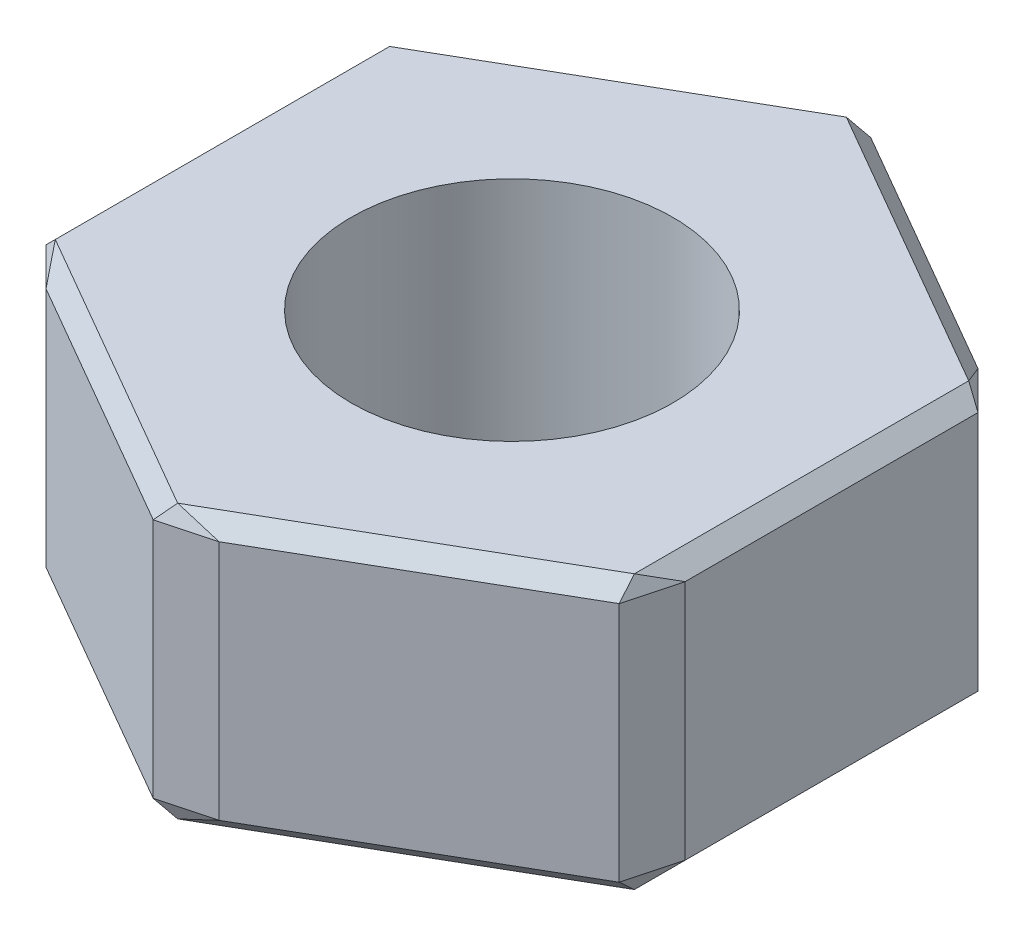
ISO-10303-21;
HEADER;
FILE_DESCRIPTION(('STEP AP214'),'2;1');
FILE_NAME('part.step','',(''),(''),'','','');
FILE_SCHEMA(('AUTOMOTIVE_DESIGN { 1 0 10303 214 1 1 1 1 }'));
ENDSEC;
DATA;
#1=APPLICATION_CONTEXT('core data for automotive mechanical design processes');
#2=APPLICATION_PROTOCOL_DEFINITION('international standard','automotive_design',2000,#1);
#3=PRODUCT_CONTEXT('',#1,'mechanical');
#4=PRODUCT('Part','Part','',(#3));
#5=PRODUCT_RELATED_PRODUCT_CATEGORY('part','',(#4));
#6=PRODUCT_DEFINITION_FORMATION('','',#4);
#7=PRODUCT_DEFINITION_CONTEXT('part definition',#1,'design');
#8=PRODUCT_DEFINITION('design','',#6,#7);
#9=PRODUCT_DEFINITION_SHAPE('','',#8);
#10=(LENGTH_UNIT() NAMED_UNIT(*) SI_UNIT(.MILLI.,.METRE.));
#11=(NAMED_UNIT(*) PLANE_ANGLE_UNIT() SI_UNIT($,.RADIAN.));
#12=(NAMED_UNIT(*) SI_UNIT($,.STERADIAN.) SOLID_ANGLE_UNIT());
#13=UNCERTAINTY_MEASURE_WITH_UNIT(LENGTH_MEASURE(1.E-05),#10,'distance_accuracy_value','');
#14=(GEOMETRIC_REPRESENTATION_CONTEXT(3) GLOBAL_UNCERTAINTY_ASSIGNED_CONTEXT((#13)) GLOBAL_UNIT_ASSIGNED_CONTEXT((#10,
#11,#12)) REPRESENTATION_CONTEXT('',''));
#15=CARTESIAN_POINT('',(0.,0.,0.));
#16=DIRECTION('',(0.,0.,1.));
#17=DIRECTION('',(1.,0.,0.));
#18=AXIS2_PLACEMENT_3D('',#15,#16,#17);
#19=CARTESIAN_POINT('',(0.,1.7,0.));
#20=DIRECTION('',(0.,1.,0.));
#21=DIRECTION('',(0.,0.,1.));
#22=AXIS2_PLACEMENT_3D('',#19,#20,#21);
#23=PLANE('',#22);
#24=DIRECTION('',(-0.866025403784438,0.,0.5));
#25=VECTOR('',#24,1.);
#26=CARTESIAN_POINT('',(-1.85,1.7,-1.01036297108185));
#27=LINE('',#26,#25);
#28=CARTESIAN_POINT('',(0.,1.7,-2.07846096908266));
#29=VERTEX_POINT('',#28);
#30=CARTESIAN_POINT('',(-1.8,1.7,-1.03923048454133));
#31=VERTEX_POINT('',#30);
#32=EDGE_CURVE('E251',#29,#31,#27,.T.);
#33=ORIENTED_EDGE('',*,*,#32,.T.);
#34=DIRECTION('',(0.,0.,1.));
#35=VECTOR('',#34,1.);
#36=CARTESIAN_POINT('',(-1.8,1.7,1.09696551146028));
#37=LINE('',#36,#35);
#38=CARTESIAN_POINT('',(-1.8,1.7,1.03923048454132));
#39=VERTEX_POINT('',#38);
#40=EDGE_CURVE('E253',#31,#39,#37,.T.);
#41=ORIENTED_EDGE('',*,*,#40,.T.);
#42=DIRECTION('',(0.866025403784439,0.,0.5));
#43=VECTOR('',#42,1.);
#44=CARTESIAN_POINT('',(0.0499999999999944,1.7,2.10732848254213));
#45=LINE('',#44,#43);
#46=CARTESIAN_POINT('',(0.,1.7,2.07846096908264));
#47=VERTEX_POINT('',#46);
#48=EDGE_CURVE('E243',#39,#47,#45,.T.);
#49=ORIENTED_EDGE('',*,*,#48,.T.);
#50=DIRECTION('',(0.86602540378444,0.,-0.499999999999998));
#51=VECTOR('',#50,1.);
#52=CARTESIAN_POINT('',(1.85,1.7,1.01036297108184));
#53=LINE('',#52,#51);
#54=CARTESIAN_POINT('',(1.8,1.7,1.03923048454132));
#55=VERTEX_POINT('',#54);
#56=EDGE_CURVE('E245',#47,#55,#53,.T.);
#57=ORIENTED_EDGE('',*,*,#56,.T.);
#58=DIRECTION('',(0.,0.,-1.));
#59=VECTOR('',#58,1.);
#60=CARTESIAN_POINT('',(1.8,1.7,-1.09696551146029));
#61=LINE('',#60,#59);
#62=CARTESIAN_POINT('',(1.8,1.7,-1.03923048454133));
#63=VERTEX_POINT('',#62);
#64=EDGE_CURVE('E247',#55,#63,#61,.T.);
#65=ORIENTED_EDGE('',*,*,#64,.T.);
#66=DIRECTION('',(-0.866025403784439,0.,-0.5));
#67=VECTOR('',#66,1.);
#68=CARTESIAN_POINT('',(-0.0500000000000039,1.7,-2.10732848254214));
#69=LINE('',#68,#67);
#70=EDGE_CURVE('E249',#63,#29,#69,.T.);
#71=ORIENTED_EDGE('',*,*,#70,.T.);
#72=EDGE_LOOP('',(#33,#41,#49,#57,#65,#71));
#73=FACE_BOUND('',#72,.T.);
#74=CARTESIAN_POINT('',(0.,1.7,0.));
#75=DIRECTION('',(0.,1.,0.));
#76=DIRECTION('',(0.,0.,1.));
#77=AXIS2_PLACEMENT_3D('',#74,#75,#76);
#78=CIRCLE('',#77,1.);
#79=CARTESIAN_POINT('',(0.,1.7,1.));
#80=VERTEX_POINT('',#79);
#81=EDGE_CURVE('E190',#80,#80,#78,.T.);
#82=ORIENTED_EDGE('',*,*,#81,.F.);
#83=EDGE_LOOP('',(#82));
#84=FACE_BOUND('',#83,.T.);
#85=ADVANCED_FACE('F37',(#73,#84),#23,.T.);
#86=CARTESIAN_POINT('',(0.,0.,0.));
#87=DIRECTION('',(0.,1.,0.));
#88=DIRECTION('',(0.,0.,1.));
#89=AXIS2_PLACEMENT_3D('',#86,#87,#88);
#90=PLANE('',#89);
#91=DIRECTION('',(-0.866025403784439,0.,-0.5));
#92=VECTOR('',#91,1.);
#93=CARTESIAN_POINT('',(-0.899999999999999,0.,1.55884572681199));
#94=LINE('',#93,#92);
#95=CARTESIAN_POINT('',(0.,0.,2.07846096908265));
#96=VERTEX_POINT('',#95);
#97=CARTESIAN_POINT('',(-1.8,0.,1.03923048454132));
#98=VERTEX_POINT('',#97);
#99=EDGE_CURVE('E259',#96,#98,#94,.T.);
#100=ORIENTED_EDGE('',*,*,#99,.T.);
#101=DIRECTION('',(0.,0.,-1.));
#102=VECTOR('',#101,1.);
#103=CARTESIAN_POINT('',(-1.8,0.,0.));
#104=LINE('',#103,#102);
#105=CARTESIAN_POINT('',(-1.8,0.,-1.03923048454133));
#106=VERTEX_POINT('',#105);
#107=EDGE_CURVE('E46',#98,#106,#104,.T.);
#108=ORIENTED_EDGE('',*,*,#107,.T.);
#109=DIRECTION('',(0.866025403784438,0.,-0.5));
#110=VECTOR('',#109,1.);
#111=CARTESIAN_POINT('',(-0.900000000000003,0.,-1.55884572681199));
#112=LINE('',#111,#110);
#113=CARTESIAN_POINT('',(0.,0.,-2.07846096908266));
#114=VERTEX_POINT('',#113);
#115=EDGE_CURVE('E62',#106,#114,#112,.T.);
#116=ORIENTED_EDGE('',*,*,#115,.T.);
#117=DIRECTION('',(0.866025403784439,0.,0.5));
#118=VECTOR('',#117,1.);
#119=CARTESIAN_POINT('',(0.900000000000001,0.,-1.55884572681199));
#120=LINE('',#119,#118);
#121=CARTESIAN_POINT('',(1.8,0.,-1.03923048454133));
#122=VERTEX_POINT('',#121);
#123=EDGE_CURVE('E265',#114,#122,#120,.T.);
#124=ORIENTED_EDGE('',*,*,#123,.T.);
#125=DIRECTION('',(0.,0.,1.));
#126=VECTOR('',#125,1.);
#127=CARTESIAN_POINT('',(1.8,0.,0.));
#128=LINE('',#127,#126);
#129=CARTESIAN_POINT('',(1.8,0.,1.03923048454132));
#130=VERTEX_POINT('',#129);
#131=EDGE_CURVE('E263',#122,#130,#128,.T.);
#132=ORIENTED_EDGE('',*,*,#131,.T.);
#133=DIRECTION('',(-0.86602540378444,0.,0.499999999999998));
#134=VECTOR('',#133,1.);
#135=CARTESIAN_POINT('',(0.899999999999993,0.,1.55884572681199));
#136=LINE('',#135,#134);
#137=EDGE_CURVE('E261',#130,#96,#136,.T.);
#138=ORIENTED_EDGE('',*,*,#137,.T.);
#139=EDGE_LOOP('',(#100,#108,#116,#124,#132,#138));
#140=FACE_BOUND('',#139,.T.);
#141=CARTESIAN_POINT('',(0.,0.,0.));
#142=DIRECTION('',(0.,1.,0.));
#143=DIRECTION('',(0.,0.,1.));
#144=AXIS2_PLACEMENT_3D('',#141,#142,#143);
#145=CIRCLE('',#144,1.1);
#146=CARTESIAN_POINT('',(0.,0.,1.1));
#147=VERTEX_POINT('',#146);
#148=EDGE_CURVE('E256',#147,#147,#145,.T.);
#149=ORIENTED_EDGE('',*,*,#148,.T.);
#150=EDGE_LOOP('',(#149));
#151=FACE_BOUND('',#150,.T.);
#152=ADVANCED_FACE('F372',(#140,#151),#90,.F.);
#153=CARTESIAN_POINT('',(1.9,1.7,-1.09696551146029));
#154=DIRECTION('',(-0.5,0.,0.866025403784439));
#155=DIRECTION('',(0.866025403784439,0.,0.5));
#156=AXIS2_PLACEMENT_3D('',#153,#154,#155);
#157=PLANE('',#156);
#158=DIRECTION('',(0.,1.,0.));
#159=VECTOR('',#158,1.);
#160=CARTESIAN_POINT('',(0.0866025403784413,1.7,-2.14393102292058));
#161=LINE('',#160,#159);
#162=CARTESIAN_POINT('',(0.0866025403784412,0.1,-2.14393102292058));
#163=VERTEX_POINT('',#162);
#164=CARTESIAN_POINT('',(0.0866025403784412,1.6,-2.14393102292058));
#165=VERTEX_POINT('',#164);
#166=EDGE_CURVE('E209',#163,#165,#161,.T.);
#167=ORIENTED_EDGE('',*,*,#166,.T.);
#168=DIRECTION('',(0.866025403784439,0.,0.5));
#169=VECTOR('',#168,1.);
#170=CARTESIAN_POINT('',(1.9,1.6,-1.09696551146029));
#171=LINE('',#170,#169);
#172=CARTESIAN_POINT('',(1.66339745962156,1.6,-1.23356805183873));
#173=VERTEX_POINT('',#172);
#174=EDGE_CURVE('E214',#165,#173,#171,.T.);
#175=ORIENTED_EDGE('',*,*,#174,.T.);
#176=DIRECTION('',(0.,-1.,0.));
#177=VECTOR('',#176,1.);
#178=CARTESIAN_POINT('',(1.66339745962156,1.7,-1.23356805183873));
#179=LINE('',#178,#177);
#180=CARTESIAN_POINT('',(1.66339745962156,0.1,-1.23356805183873));
#181=VERTEX_POINT('',#180);
#182=EDGE_CURVE('E211',#173,#181,#179,.T.);
#183=ORIENTED_EDGE('',*,*,#182,.T.);
#184=DIRECTION('',(-0.866025403784439,0.,-0.5));
#185=VECTOR('',#184,1.);
#186=CARTESIAN_POINT('',(1.9,0.1,-1.09696551146029));
#187=LINE('',#186,#185);
#188=EDGE_CURVE('E207',#181,#163,#187,.T.);
#189=ORIENTED_EDGE('',*,*,#188,.T.);
#190=EDGE_LOOP('',(#167,#175,#183,#189));
#191=FACE_BOUND('',#190,.T.);
#192=ADVANCED_FACE('F378',(#191),#157,.F.);
#193=CARTESIAN_POINT('',(0.,1.7,-2.19393102292058));
#194=DIRECTION('',(0.5,0.,0.866025403784438));
#195=DIRECTION('',(0.866025403784439,0.,-0.5));
#196=AXIS2_PLACEMENT_3D('',#193,#194,#195);
#197=PLANE('',#196);
#198=DIRECTION('',(0.,1.,0.));
#199=VECTOR('',#198,1.);
#200=CARTESIAN_POINT('',(-1.81339745962156,1.7,-1.14696551146029));
#201=LINE('',#200,#199);
#202=CARTESIAN_POINT('',(-1.81339745962156,0.1,-1.14696551146029));
#203=VERTEX_POINT('',#202);
#204=CARTESIAN_POINT('',(-1.81339745962156,1.6,-1.14696551146029));
#205=VERTEX_POINT('',#204);
#206=EDGE_CURVE('E172',#203,#205,#201,.T.);
#207=ORIENTED_EDGE('',*,*,#206,.T.);
#208=DIRECTION('',(0.866025403784439,0.,-0.5));
#209=VECTOR('',#208,1.);
#210=CARTESIAN_POINT('',(0.,1.6,-2.19393102292058));
#211=LINE('',#210,#209);
#212=CARTESIAN_POINT('',(-0.236602540378449,1.6,-2.05732848254214));
#213=VERTEX_POINT('',#212);
#214=EDGE_CURVE('E205',#205,#213,#211,.T.);
#215=ORIENTED_EDGE('',*,*,#214,.T.);
#216=DIRECTION('',(0.,-1.,0.));
#217=VECTOR('',#216,1.);
#218=CARTESIAN_POINT('',(-0.236602540378449,1.7,-2.05732848254214));
#219=LINE('',#218,#217);
#220=CARTESIAN_POINT('',(-0.236602540378449,0.1,-2.05732848254214));
#221=VERTEX_POINT('',#220);
#222=EDGE_CURVE('E202',#213,#221,#219,.T.);
#223=ORIENTED_EDGE('',*,*,#222,.T.);
#224=DIRECTION('',(-0.866025403784439,0.,0.5));
#225=VECTOR('',#224,1.);
#226=CARTESIAN_POINT('',(0.,0.1,-2.19393102292058));
#227=LINE('',#226,#225);
#228=EDGE_CURVE('E197',#221,#203,#227,.T.);
#229=ORIENTED_EDGE('',*,*,#228,.T.);
#230=EDGE_LOOP('',(#207,#215,#223,#229));
#231=FACE_BOUND('',#230,.T.);
#232=ADVANCED_FACE('F396',(#231),#197,.F.);
#233=CARTESIAN_POINT('',(-1.9,1.7,-1.09696551146029));
#234=DIRECTION('',(1.,0.,0.));
#235=DIRECTION('',(0.,0.,-1.));
#236=AXIS2_PLACEMENT_3D('',#233,#234,#235);
#237=PLANE('',#236);
#238=DIRECTION('',(0.,1.,0.));
#239=VECTOR('',#238,1.);
#240=CARTESIAN_POINT('',(-1.9,1.7,0.996965511460282));
#241=LINE('',#240,#239);
#242=CARTESIAN_POINT('',(-1.9,0.1,0.996965511460282));
#243=VERTEX_POINT('',#242);
#244=CARTESIAN_POINT('',(-1.9,1.6,0.996965511460282));
#245=VERTEX_POINT('',#244);
#246=EDGE_CURVE('E189',#243,#245,#241,.T.);
#247=ORIENTED_EDGE('',*,*,#246,.T.);
#248=DIRECTION('',(0.,0.,-1.));
#249=VECTOR('',#248,1.);
#250=CARTESIAN_POINT('',(-1.9,1.6,-1.09696551146029));
#251=LINE('',#250,#249);
#252=CARTESIAN_POINT('',(-1.9,1.6,-0.823760430703407));
#253=VERTEX_POINT('',#252);
#254=EDGE_CURVE('E194',#245,#253,#251,.T.);
#255=ORIENTED_EDGE('',*,*,#254,.T.);
#256=DIRECTION('',(0.,-1.,0.));
#257=VECTOR('',#256,1.);
#258=CARTESIAN_POINT('',(-1.9,1.7,-0.823760430703407));
#259=LINE('',#258,#257);
#260=CARTESIAN_POINT('',(-1.9,0.1,-0.823760430703407));
#261=VERTEX_POINT('',#260);
#262=EDGE_CURVE('E170',#253,#261,#259,.T.);
#263=ORIENTED_EDGE('',*,*,#262,.T.);
#264=DIRECTION('',(0.,0.,1.));
#265=VECTOR('',#264,1.);
#266=CARTESIAN_POINT('',(-1.9,0.1,-1.09696551146029));
#267=LINE('',#266,#265);
#268=EDGE_CURVE('E183',#261,#243,#267,.T.);
#269=ORIENTED_EDGE('',*,*,#268,.T.);
#270=EDGE_LOOP('',(#247,#255,#263,#269));
#271=FACE_BOUND('',#270,.T.);
#272=ADVANCED_FACE('F192',(#271),#237,.F.);
#273=CARTESIAN_POINT('',(-1.9,1.7,1.09696551146028));
#274=DIRECTION('',(0.5,0.,-0.866025403784439));
#275=DIRECTION('',(-0.866025403784439,0.,-0.5));
#276=AXIS2_PLACEMENT_3D('',#273,#274,#275);
#277=PLANE('',#276);
#278=DIRECTION('',(-0.866025403784439,0.,-0.5));
#279=VECTOR('',#278,1.);
#280=CARTESIAN_POINT('',(-1.9,1.6,1.09696551146028));
#281=LINE('',#280,#279);
#282=CARTESIAN_POINT('',(-0.0866025403784507,1.6,2.14393102292057));
#283=VERTEX_POINT('',#282);
#284=CARTESIAN_POINT('',(-1.66339745962156,1.6,1.23356805183873));
#285=VERTEX_POINT('',#284);
#286=EDGE_CURVE('E238',#283,#285,#281,.T.);
#287=ORIENTED_EDGE('',*,*,#286,.T.);
#288=DIRECTION('',(0.,-1.,0.));
#289=VECTOR('',#288,1.);
#290=CARTESIAN_POINT('',(-1.66339745962156,1.7,1.23356805183873));
#291=LINE('',#290,#289);
#292=CARTESIAN_POINT('',(-1.66339745962156,0.1,1.23356805183873));
#293=VERTEX_POINT('',#292);
#294=EDGE_CURVE('E240',#285,#293,#291,.T.);
#295=ORIENTED_EDGE('',*,*,#294,.T.);
#296=DIRECTION('',(0.866025403784439,0.,0.5));
#297=VECTOR('',#296,1.);
#298=CARTESIAN_POINT('',(-1.9,0.1,1.09696551146028));
#299=LINE('',#298,#297);
#300=CARTESIAN_POINT('',(-0.0866025403784507,0.1,2.14393102292057));
#301=VERTEX_POINT('',#300);
#302=EDGE_CURVE('E234',#293,#301,#299,.T.);
#303=ORIENTED_EDGE('',*,*,#302,.T.);
#304=DIRECTION('',(0.,1.,0.));
#305=VECTOR('',#304,1.);
#306=CARTESIAN_POINT('',(-0.0866025403784504,1.7,2.14393102292057));
#307=LINE('',#306,#305);
#308=EDGE_CURVE('E236',#301,#283,#307,.T.);
#309=ORIENTED_EDGE('',*,*,#308,.T.);
#310=EDGE_LOOP('',(#287,#295,#303,#309));
#311=FACE_BOUND('',#310,.T.);
#312=ADVANCED_FACE('F389',(#311),#277,.F.);
#313=CARTESIAN_POINT('',(0.,1.7,2.19393102292057));
#314=DIRECTION('',(-0.499999999999998,0.,-0.86602540378444));
#315=DIRECTION('',(-0.86602540378444,0.,0.499999999999998));
#316=AXIS2_PLACEMENT_3D('',#313,#314,#315);
#317=PLANE('',#316);
#318=DIRECTION('',(0.86602540378444,0.,-0.499999999999998));
#319=VECTOR('',#318,1.);
#320=CARTESIAN_POINT('',(0.,0.1,2.19393102292057));
#321=LINE('',#320,#319);
#322=CARTESIAN_POINT('',(0.236602540378441,0.1,2.05732848254213));
#323=VERTEX_POINT('',#322);
#324=CARTESIAN_POINT('',(1.81339745962155,0.1,1.14696551146029));
#325=VERTEX_POINT('',#324);
#326=EDGE_CURVE('E225',#323,#325,#321,.T.);
#327=ORIENTED_EDGE('',*,*,#326,.T.);
#328=DIRECTION('',(0.,1.,0.));
#329=VECTOR('',#328,1.);
#330=CARTESIAN_POINT('',(1.81339745962155,1.7,1.14696551146029));
#331=LINE('',#330,#329);
#332=CARTESIAN_POINT('',(1.81339745962155,1.6,1.14696551146029));
#333=VERTEX_POINT('',#332);
#334=EDGE_CURVE('E231',#325,#333,#331,.T.);
#335=ORIENTED_EDGE('',*,*,#334,.T.);
#336=DIRECTION('',(-0.86602540378444,0.,0.499999999999998));
#337=VECTOR('',#336,1.);
#338=CARTESIAN_POINT('',(0.,1.6,2.19393102292057));
#339=LINE('',#338,#337);
#340=CARTESIAN_POINT('',(0.236602540378441,1.6,2.05732848254213));
#341=VERTEX_POINT('',#340);
#342=EDGE_CURVE('E229',#333,#341,#339,.T.);
#343=ORIENTED_EDGE('',*,*,#342,.T.);
#344=DIRECTION('',(0.,-1.,0.));
#345=VECTOR('',#344,1.);
#346=CARTESIAN_POINT('',(0.236602540378441,1.7,2.05732848254213));
#347=LINE('',#346,#345);
#348=EDGE_CURVE('E227',#341,#323,#347,.T.);
#349=ORIENTED_EDGE('',*,*,#348,.T.);
#350=EDGE_LOOP('',(#327,#335,#343,#349));
#351=FACE_BOUND('',#350,.T.);
#352=ADVANCED_FACE('F385',(#351),#317,.F.);
#353=CARTESIAN_POINT('',(1.9,1.7,1.09696551146029));
#354=DIRECTION('',(-1.,0.,0.));
#355=DIRECTION('',(0.,0.,1.));
#356=AXIS2_PLACEMENT_3D('',#353,#354,#355);
#357=PLANE('',#356);
#358=DIRECTION('',(0.,1.,0.));
#359=VECTOR('',#358,1.);
#360=CARTESIAN_POINT('',(1.9,1.7,-0.996965511460289));
#361=LINE('',#360,#359);
#362=CARTESIAN_POINT('',(1.9,0.1,-0.996965511460289));
#363=VERTEX_POINT('',#362);
#364=CARTESIAN_POINT('',(1.9,1.6,-0.996965511460289));
#365=VERTEX_POINT('',#364);
#366=EDGE_CURVE('E220',#363,#365,#361,.T.);
#367=ORIENTED_EDGE('',*,*,#366,.T.);
#368=DIRECTION('',(0.,0.,1.));
#369=VECTOR('',#368,1.);
#370=CARTESIAN_POINT('',(1.9,1.6,1.09696551146029));
#371=LINE('',#370,#369);
#372=CARTESIAN_POINT('',(1.9,1.6,0.823760430703402));
#373=VERTEX_POINT('',#372);
#374=EDGE_CURVE('E223',#365,#373,#371,.T.);
#375=ORIENTED_EDGE('',*,*,#374,.T.);
#376=DIRECTION('',(0.,-1.,0.));
#377=VECTOR('',#376,1.);
#378=CARTESIAN_POINT('',(1.9,1.7,0.823760430703402));
#379=LINE('',#378,#377);
#380=CARTESIAN_POINT('',(1.9,0.1,0.823760430703402));
#381=VERTEX_POINT('',#380);
#382=EDGE_CURVE('E218',#373,#381,#379,.T.);
#383=ORIENTED_EDGE('',*,*,#382,.T.);
#384=DIRECTION('',(0.,0.,-1.));
#385=VECTOR('',#384,1.);
#386=CARTESIAN_POINT('',(1.9,0.1,1.09696551146029));
#387=LINE('',#386,#385);
#388=EDGE_CURVE('E216',#381,#363,#387,.T.);
#389=ORIENTED_EDGE('',*,*,#388,.T.);
#390=EDGE_LOOP('',(#367,#375,#383,#389));
#391=FACE_BOUND('',#390,.T.);
#392=ADVANCED_FACE('F382',(#391),#357,.F.);
#393=CARTESIAN_POINT('',(0.,1.7,0.));
#394=DIRECTION('',(0.,-1.,0.));
#395=DIRECTION('',(0.,0.,-1.));
#396=AXIS2_PLACEMENT_3D('',#393,#394,#395);
#397=CYLINDRICAL_SURFACE('',#396,1.);
#398=CARTESIAN_POINT('',(0.,0.100000000000001,0.));
#399=DIRECTION('',(0.,1.,0.));
#400=DIRECTION('',(0.,0.,1.));
#401=AXIS2_PLACEMENT_3D('',#398,#399,#400);
#402=CIRCLE('',#401,1.);
#403=CARTESIAN_POINT('',(0.,0.100000000000001,1.));
#404=VERTEX_POINT('',#403);
#405=EDGE_CURVE('E11',#404,#404,#402,.F.);
#406=ORIENTED_EDGE('',*,*,#405,.T.);
#407=EDGE_LOOP('',(#406));
#408=FACE_BOUND('',#407,.T.);
#409=ORIENTED_EDGE('',*,*,#81,.T.);
#410=EDGE_LOOP('',(#409));
#411=FACE_BOUND('',#410,.T.);
#412=ADVANCED_FACE('F369',(#408,#411),#397,.F.);
#413=CARTESIAN_POINT('',(1.9,1.7,0.823760430703402));
#414=DIRECTION('',(-0.965925826289067,0.,-0.258819045102524));
#415=DIRECTION('',(0.,-1.,0.));
#416=AXIS2_PLACEMENT_3D('',#413,#414,#415);
#417=PLANE('',#416);
#418=DIRECTION('',(-0.258819045102524,0.,0.965925826289067));
#419=VECTOR('',#418,1.);
#420=CARTESIAN_POINT('',(1.81339745962155,1.6,1.14696551146029));
#421=LINE('',#420,#419);
#422=EDGE_CURVE('E41',#333,#373,#421,.F.);
#423=ORIENTED_EDGE('',*,*,#422,.F.);
#424=ORIENTED_EDGE('',*,*,#334,.F.);
#425=DIRECTION('',(0.258819045102524,0.,-0.965925826289067));
#426=VECTOR('',#425,1.);
#427=CARTESIAN_POINT('',(1.9,0.1,0.823760430703402));
#428=LINE('',#427,#426);
#429=EDGE_CURVE('E354',#381,#325,#428,.F.);
#430=ORIENTED_EDGE('',*,*,#429,.F.);
#431=ORIENTED_EDGE('',*,*,#382,.F.);
#432=EDGE_LOOP('',(#423,#424,#430,#431));
#433=FACE_BOUND('',#432,.T.);
#434=ADVANCED_FACE('F510',(#433),#417,.F.);
#435=CARTESIAN_POINT('',(1.81339745962155,1.6,1.14696551146029));
#436=DIRECTION('',(0.894273544867825,0.377964473009236,0.239619874159855));
#437=DIRECTION('',(-0.389306214312527,0.921108392914563,0.));
#438=AXIS2_PLACEMENT_3D('',#435,#436,#437);
#439=PLANE('',#438);
#440=DIRECTION('',(0.0907675134870674,-0.677497944020811,0.729902592366234));
#441=VECTOR('',#440,1.);
#442=CARTESIAN_POINT('',(1.81339745962155,1.6,1.14696551146029));
#443=LINE('',#442,#441);
#444=EDGE_CURVE('E349',#333,#55,#443,.F.);
#445=ORIENTED_EDGE('',*,*,#444,.F.);
#446=ORIENTED_EDGE('',*,*,#422,.T.);
#447=DIRECTION('',(-0.387995381130111,0.387995381130111,0.836013856609685));
#448=VECTOR('',#447,1.);
#449=CARTESIAN_POINT('',(1.78212494229746,1.71787505770254,1.07774588099654));
#450=LINE('',#449,#448);
#451=EDGE_CURVE('E352',#55,#373,#450,.F.);
#452=ORIENTED_EDGE('',*,*,#451,.F.);
#453=EDGE_LOOP('',(#445,#446,#452));
#454=FACE_BOUND('',#453,.T.);
#455=ADVANCED_FACE('F508',(#454),#439,.T.);
#456=CARTESIAN_POINT('',(1.9,0.1,0.823760430703402));
#457=DIRECTION('',(0.894273544867827,-0.377964473009231,0.239619874159855));
#458=DIRECTION('',(0.389306214312522,0.921108392914565,0.));
#459=AXIS2_PLACEMENT_3D('',#456,#457,#458);
#460=PLANE('',#459);
#461=DIRECTION('',(-0.387995381130109,-0.387995381130109,0.836013856609688));
#462=VECTOR('',#461,1.);
#463=CARTESIAN_POINT('',(1.9,0.1,0.823760430703402));
#464=LINE('',#463,#462);
#465=EDGE_CURVE('E343',#381,#130,#464,.T.);
#466=ORIENTED_EDGE('',*,*,#465,.F.);
#467=ORIENTED_EDGE('',*,*,#429,.T.);
#468=DIRECTION('',(0.0907675134870613,0.677497944020809,0.729902592366237));
#469=VECTOR('',#468,1.);
#470=CARTESIAN_POINT('',(1.79269815245204,-0.0545017320762091,0.980513028817718));
#471=LINE('',#470,#469);
#472=EDGE_CURVE('E346',#130,#325,#471,.T.);
#473=ORIENTED_EDGE('',*,*,#472,.F.);
#474=EDGE_LOOP('',(#466,#467,#473));
#475=FACE_BOUND('',#474,.T.);
#476=ADVANCED_FACE('F504',(#475),#460,.T.);
#477=CARTESIAN_POINT('',(1.8,1.7,0.));
#478=DIRECTION('',(0.707106781186547,0.707106781186547,0.));
#479=DIRECTION('',(0.,0.,1.));
#480=AXIS2_PLACEMENT_3D('',#477,#478,#479);
#481=PLANE('',#480);
#482=ORIENTED_EDGE('',*,*,#451,.T.);
#483=ORIENTED_EDGE('',*,*,#374,.F.);
#484=DIRECTION('',(0.677497944020808,-0.677497944020808,0.286344323664983));
#485=VECTOR('',#484,1.);
#486=CARTESIAN_POINT('',(1.9,1.6,-0.996965511460289));
#487=LINE('',#486,#485);
#488=EDGE_CURVE('E338',#63,#365,#487,.T.);
#489=ORIENTED_EDGE('',*,*,#488,.F.);
#490=ORIENTED_EDGE('',*,*,#64,.F.);
#491=EDGE_LOOP('',(#482,#483,#489,#490));
#492=FACE_BOUND('',#491,.T.);
#493=ADVANCED_FACE('F500',(#492),#481,.T.);
#494=CARTESIAN_POINT('',(0.899999999999993,1.7,1.55884572681199));
#495=DIRECTION('',(0.353553390593272,0.707106781186547,0.612372435695795));
#496=DIRECTION('',(-0.86602540378444,0.,0.499999999999998));
#497=AXIS2_PLACEMENT_3D('',#494,#495,#496);
#498=PLANE('',#497);
#499=ORIENTED_EDGE('',*,*,#444,.T.);
#500=ORIENTED_EDGE('',*,*,#56,.F.);
#501=DIRECTION('',(-0.918006928304848,0.387995381130101,0.0819930716951527));
#502=VECTOR('',#501,1.);
#503=CARTESIAN_POINT('',(0.236602540378441,1.6,2.05732848254213));
#504=LINE('',#503,#502);
#505=EDGE_CURVE('E335',#341,#47,#504,.T.);
#506=ORIENTED_EDGE('',*,*,#505,.F.);
#507=ORIENTED_EDGE('',*,*,#342,.F.);
#508=EDGE_LOOP('',(#499,#500,#506,#507));
#509=FACE_BOUND('',#508,.T.);
#510=ADVANCED_FACE('F496',(#509),#498,.T.);
#511=CARTESIAN_POINT('',(0.236602540378441,1.7,2.05732848254213));
#512=DIRECTION('',(-0.25881904510252,0.,-0.965925826289069));
#513=DIRECTION('',(0.,-1.,0.));
#514=AXIS2_PLACEMENT_3D('',#511,#512,#513);
#515=PLANE('',#514);
#516=DIRECTION('',(0.965925826289068,0.,-0.25881904510252));
#517=VECTOR('',#516,1.);
#518=CARTESIAN_POINT('',(0.236602540378441,0.1,2.05732848254213));
#519=LINE('',#518,#517);
#520=EDGE_CURVE('E329',#323,#301,#519,.F.);
#521=ORIENTED_EDGE('',*,*,#520,.F.);
#522=ORIENTED_EDGE('',*,*,#348,.F.);
#523=DIRECTION('',(-0.965925826289069,0.,0.25881904510252));
#524=VECTOR('',#523,1.);
#525=CARTESIAN_POINT('',(0.236602540378441,1.6,2.05732848254213));
#526=LINE('',#525,#524);
#527=EDGE_CURVE('E332',#283,#341,#526,.F.);
#528=ORIENTED_EDGE('',*,*,#527,.F.);
#529=ORIENTED_EDGE('',*,*,#308,.F.);
#530=EDGE_LOOP('',(#521,#522,#528,#529));
#531=FACE_BOUND('',#530,.T.);
#532=ADVANCED_FACE('F492',(#531),#515,.F.);
#533=CARTESIAN_POINT('',(0.,0.1,2.19393102292057));
#534=DIRECTION('',(-0.353553390593272,0.707106781186548,-0.612372435695795));
#535=DIRECTION('',(0.86602540378444,0.,-0.499999999999998));
#536=AXIS2_PLACEMENT_3D('',#533,#534,#535);
#537=PLANE('',#536);
#538=ORIENTED_EDGE('',*,*,#472,.T.);
#539=ORIENTED_EDGE('',*,*,#326,.F.);
#540=DIRECTION('',(-0.918006928304849,-0.387995381130097,0.0819930716951567));
#541=VECTOR('',#540,1.);
#542=CARTESIAN_POINT('',(0.236602540378442,0.1,2.05732848254213));
#543=LINE('',#542,#541);
#544=EDGE_CURVE('E326',#96,#323,#543,.F.);
#545=ORIENTED_EDGE('',*,*,#544,.F.);
#546=ORIENTED_EDGE('',*,*,#137,.F.);
#547=EDGE_LOOP('',(#538,#539,#545,#546));
#548=FACE_BOUND('',#547,.T.);
#549=ADVANCED_FACE('F488',(#548),#537,.F.);
#550=CARTESIAN_POINT('',(1.9,0.1,1.09696551146029));
#551=DIRECTION('',(-0.707106781186547,0.707106781186547,0.));
#552=DIRECTION('',(0.,0.,-1.));
#553=AXIS2_PLACEMENT_3D('',#550,#551,#552);
#554=PLANE('',#553);
#555=ORIENTED_EDGE('',*,*,#465,.T.);
#556=ORIENTED_EDGE('',*,*,#131,.F.);
#557=DIRECTION('',(0.677497944020807,0.677497944020807,0.286344323664987));
#558=VECTOR('',#557,1.);
#559=CARTESIAN_POINT('',(1.74549826792379,-0.0545017320762121,-1.06226562693204));
#560=LINE('',#559,#558);
#561=EDGE_CURVE('E323',#363,#122,#560,.F.);
#562=ORIENTED_EDGE('',*,*,#561,.F.);
#563=ORIENTED_EDGE('',*,*,#388,.F.);
#564=EDGE_LOOP('',(#555,#556,#562,#563));
#565=FACE_BOUND('',#564,.T.);
#566=ADVANCED_FACE('F484',(#565),#554,.F.);
#567=CARTESIAN_POINT('',(1.66339745962156,1.7,-1.23356805183873));
#568=DIRECTION('',(-0.70710678118655,0.,0.707106781186545));
#569=DIRECTION('',(0.,-1.,0.));
#570=AXIS2_PLACEMENT_3D('',#567,#568,#569);
#571=PLANE('',#570);
#572=DIRECTION('',(0.707106781186545,0.,0.70710678118655));
#573=VECTOR('',#572,1.);
#574=CARTESIAN_POINT('',(1.9,1.6,-0.996965511460289));
#575=LINE('',#574,#573);
#576=EDGE_CURVE('E340',#365,#173,#575,.F.);
#577=ORIENTED_EDGE('',*,*,#576,.F.);
#578=ORIENTED_EDGE('',*,*,#366,.F.);
#579=DIRECTION('',(-0.707106781186544,0.,-0.70710678118655));
#580=VECTOR('',#579,1.);
#581=CARTESIAN_POINT('',(1.66339745962156,0.1,-1.23356805183873));
#582=LINE('',#581,#580);
#583=EDGE_CURVE('E320',#181,#363,#582,.F.);
#584=ORIENTED_EDGE('',*,*,#583,.F.);
#585=ORIENTED_EDGE('',*,*,#182,.F.);
#586=EDGE_LOOP('',(#577,#578,#584,#585));
#587=FACE_BOUND('',#586,.T.);
#588=ADVANCED_FACE('F480',(#587),#571,.F.);
#589=CARTESIAN_POINT('',(1.9,1.6,-0.996965511460289));
#590=DIRECTION('',(0.654653670707981,0.377964473009225,-0.654653670707975));
#591=DIRECTION('',(-0.707106781186545,0.,-0.707106781186551));
#592=AXIS2_PLACEMENT_3D('',#589,#590,#591);
#593=PLANE('',#592);
#594=ORIENTED_EDGE('',*,*,#488,.T.);
#595=ORIENTED_EDGE('',*,*,#576,.T.);
#596=DIRECTION('',(0.53001154717474,0.387995381130107,0.754020784914542));
#597=VECTOR('',#596,1.);
#598=CARTESIAN_POINT('',(1.82441778291578,1.71787505770254,-1.00449253224921));
#599=LINE('',#598,#597);
#600=EDGE_CURVE('E317',#63,#173,#599,.F.);
#601=ORIENTED_EDGE('',*,*,#600,.F.);
#602=EDGE_LOOP('',(#594,#595,#601));
#603=FACE_BOUND('',#602,.T.);
#604=ADVANCED_FACE('F476',(#603),#593,.T.);
#605=CARTESIAN_POINT('',(0.236602540378441,1.6,2.05732848254213));
#606=DIRECTION('',(0.239619874159851,0.377964473009227,0.89427354486783));
#607=DIRECTION('',(0.,-0.921108392914567,0.389306214312517));
#608=AXIS2_PLACEMENT_3D('',#605,#606,#607);
#609=PLANE('',#608);
#610=ORIENTED_EDGE('',*,*,#527,.T.);
#611=ORIENTED_EDGE('',*,*,#505,.T.);
#612=DIRECTION('',(-0.586730430533748,-0.67749794402081,0.443558268701259));
#613=VECTOR('',#612,1.);
#614=CARTESIAN_POINT('',(0.0471998845282471,1.75450173207621,2.04277865574975));
#615=LINE('',#614,#613);
#616=EDGE_CURVE('E314',#283,#47,#615,.F.);
#617=ORIENTED_EDGE('',*,*,#616,.F.);
#618=EDGE_LOOP('',(#610,#611,#617));
#619=FACE_BOUND('',#618,.T.);
#620=ADVANCED_FACE('F472',(#619),#609,.T.);
#621=CARTESIAN_POINT('',(0.236602540378441,0.1,2.05732848254213));
#622=DIRECTION('',(0.239619874159852,-0.377964473009222,0.894273544867832));
#623=DIRECTION('',(0.,-0.921108392914569,-0.389306214312513));
#624=AXIS2_PLACEMENT_3D('',#621,#622,#623);
#625=PLANE('',#624);
#626=ORIENTED_EDGE('',*,*,#544,.T.);
#627=ORIENTED_EDGE('',*,*,#520,.T.);
#628=DIRECTION('',(-0.586730430533752,0.677497944020809,0.443558268701255));
#629=VECTOR('',#628,1.);
#630=CARTESIAN_POINT('',(0.0471998845282486,-0.0545017320762138,2.04277865574975));
#631=LINE('',#630,#629);
#632=EDGE_CURVE('E311',#96,#301,#631,.T.);
#633=ORIENTED_EDGE('',*,*,#632,.F.);
#634=EDGE_LOOP('',(#626,#627,#633));
#635=FACE_BOUND('',#634,.T.);
#636=ADVANCED_FACE('F468',(#635),#625,.T.);
#637=CARTESIAN_POINT('',(1.66339745962156,0.1,-1.23356805183873));
#638=DIRECTION('',(0.654653670707981,-0.377964473009221,-0.654653670707976));
#639=DIRECTION('',(-0.707106781186545,0.,-0.70710678118655));
#640=AXIS2_PLACEMENT_3D('',#637,#638,#639);
#641=PLANE('',#640);
#642=ORIENTED_EDGE('',*,*,#583,.T.);
#643=ORIENTED_EDGE('',*,*,#561,.T.);
#644=DIRECTION('',(0.530011547174743,-0.387995381130104,0.754020784914541));
#645=VECTOR('',#644,1.);
#646=CARTESIAN_POINT('',(1.66339745962156,0.1,-1.23356805183873));
#647=LINE('',#646,#645);
#648=EDGE_CURVE('E308',#181,#122,#647,.T.);
#649=ORIENTED_EDGE('',*,*,#648,.F.);
#650=EDGE_LOOP('',(#642,#643,#649));
#651=FACE_BOUND('',#650,.T.);
#652=ADVANCED_FACE('F464',(#651),#641,.T.);
#653=CARTESIAN_POINT('',(0.900000000000001,1.7,-1.55884572681199));
#654=DIRECTION('',(0.353553390593275,0.707106781186546,-0.612372435695796));
#655=DIRECTION('',(0.866025403784439,0.,0.5));
#656=AXIS2_PLACEMENT_3D('',#653,#654,#655);
#657=PLANE('',#656);
#658=ORIENTED_EDGE('',*,*,#600,.T.);
#659=ORIENTED_EDGE('',*,*,#174,.F.);
#660=DIRECTION('',(0.586730430533747,-0.677497944020811,-0.443558268701259));
#661=VECTOR('',#660,1.);
#662=CARTESIAN_POINT('',(0.0866025403784412,1.6,-2.14393102292058));
#663=LINE('',#662,#661);
#664=EDGE_CURVE('E302',#29,#165,#663,.T.);
#665=ORIENTED_EDGE('',*,*,#664,.F.);
#666=ORIENTED_EDGE('',*,*,#70,.F.);
#667=EDGE_LOOP('',(#658,#659,#665,#666));
#668=FACE_BOUND('',#667,.T.);
#669=ADVANCED_FACE('F460',(#668),#657,.T.);
#670=CARTESIAN_POINT('',(-0.899999999999998,1.7,1.55884572681199));
#671=DIRECTION('',(-0.353553390593275,0.707106781186546,0.612372435695796));
#672=DIRECTION('',(-0.866025403784439,0.,-0.5));
#673=AXIS2_PLACEMENT_3D('',#670,#671,#672);
#674=PLANE('',#673);
#675=ORIENTED_EDGE('',*,*,#616,.T.);
#676=ORIENTED_EDGE('',*,*,#48,.F.);
#677=DIRECTION('',(-0.530011547174739,0.387995381130108,-0.754020784914542));
#678=VECTOR('',#677,1.);
#679=CARTESIAN_POINT('',(-1.82441778291578,1.71787505770254,1.0044925322492));
#680=LINE('',#679,#678);
#681=EDGE_CURVE('E299',#285,#39,#680,.T.);
#682=ORIENTED_EDGE('',*,*,#681,.F.);
#683=ORIENTED_EDGE('',*,*,#286,.F.);
#684=EDGE_LOOP('',(#675,#676,#682,#683));
#685=FACE_BOUND('',#684,.T.);
#686=ADVANCED_FACE('F456',(#685),#674,.T.);
#687=CARTESIAN_POINT('',(-1.66339745962156,1.7,1.23356805183873));
#688=DIRECTION('',(0.70710678118655,0.,-0.707106781186545));
#689=DIRECTION('',(0.,-1.,0.));
#690=AXIS2_PLACEMENT_3D('',#687,#688,#689);
#691=PLANE('',#690);
#692=DIRECTION('',(0.707106781186545,0.,0.707106781186551));
#693=VECTOR('',#692,1.);
#694=CARTESIAN_POINT('',(-1.66339745962156,0.1,1.23356805183873));
#695=LINE('',#694,#693);
#696=EDGE_CURVE('E293',#293,#243,#695,.F.);
#697=ORIENTED_EDGE('',*,*,#696,.F.);
#698=ORIENTED_EDGE('',*,*,#294,.F.);
#699=DIRECTION('',(-0.707106781186545,0.,-0.70710678118655));
#700=VECTOR('',#699,1.);
#701=CARTESIAN_POINT('',(-1.9,1.6,0.996965511460282));
#702=LINE('',#701,#700);
#703=EDGE_CURVE('E296',#245,#285,#702,.F.);
#704=ORIENTED_EDGE('',*,*,#703,.F.);
#705=ORIENTED_EDGE('',*,*,#246,.F.);
#706=EDGE_LOOP('',(#697,#698,#704,#705));
#707=FACE_BOUND('',#706,.T.);
#708=ADVANCED_FACE('F452',(#707),#691,.F.);
#709=CARTESIAN_POINT('',(-1.9,0.1,1.09696551146028));
#710=DIRECTION('',(0.353553390593274,0.707106781186547,-0.612372435695795));
#711=DIRECTION('',(0.866025403784439,0.,0.5));
#712=AXIS2_PLACEMENT_3D('',#709,#710,#711);
#713=PLANE('',#712);
#714=ORIENTED_EDGE('',*,*,#632,.T.);
#715=ORIENTED_EDGE('',*,*,#302,.F.);
#716=DIRECTION('',(-0.530011547174743,-0.387995381130104,-0.754020784914541));
#717=VECTOR('',#716,1.);
#718=CARTESIAN_POINT('',(-1.66339745962156,0.1,1.23356805183873));
#719=LINE('',#718,#717);
#720=EDGE_CURVE('E291',#98,#293,#719,.F.);
#721=ORIENTED_EDGE('',*,*,#720,.F.);
#722=ORIENTED_EDGE('',*,*,#99,.F.);
#723=EDGE_LOOP('',(#714,#715,#721,#722));
#724=FACE_BOUND('',#723,.T.);
#725=ADVANCED_FACE('F448',(#724),#713,.F.);
#726=CARTESIAN_POINT('',(1.9,0.1,-1.09696551146029));
#727=DIRECTION('',(-0.353553390593274,0.707106781186547,0.612372435695795));
#728=DIRECTION('',(-0.866025403784439,0.,-0.5));
#729=AXIS2_PLACEMENT_3D('',#726,#727,#728);
#730=PLANE('',#729);
#731=ORIENTED_EDGE('',*,*,#648,.T.);
#732=ORIENTED_EDGE('',*,*,#123,.F.);
#733=DIRECTION('',(0.586730430533755,0.677497944020808,-0.443558268701252));
#734=VECTOR('',#733,1.);
#735=CARTESIAN_POINT('',(-0.0471998845282588,-0.0545017320762136,-2.04277865574976));
#736=LINE('',#735,#734);
#737=EDGE_CURVE('E288',#163,#114,#736,.F.);
#738=ORIENTED_EDGE('',*,*,#737,.F.);
#739=ORIENTED_EDGE('',*,*,#188,.F.);
#740=EDGE_LOOP('',(#731,#732,#738,#739));
#741=FACE_BOUND('',#740,.T.);
#742=ADVANCED_FACE('F444',(#741),#730,.F.);
#743=CARTESIAN_POINT('',(-0.236602540378449,1.7,-2.05732848254214));
#744=DIRECTION('',(0.258819045102521,0.,0.965925826289068));
#745=DIRECTION('',(0.,-1.,0.));
#746=AXIS2_PLACEMENT_3D('',#743,#744,#745);
#747=PLANE('',#746);
#748=DIRECTION('',(0.965925826289068,0.,-0.258819045102521));
#749=VECTOR('',#748,1.);
#750=CARTESIAN_POINT('',(0.0866025403784412,1.6,-2.14393102292058));
#751=LINE('',#750,#749);
#752=EDGE_CURVE('E305',#165,#213,#751,.F.);
#753=ORIENTED_EDGE('',*,*,#752,.F.);
#754=ORIENTED_EDGE('',*,*,#166,.F.);
#755=DIRECTION('',(-0.965925826289068,0.,0.258819045102521));
#756=VECTOR('',#755,1.);
#757=CARTESIAN_POINT('',(-0.236602540378449,0.1,-2.05732848254214));
#758=LINE('',#757,#756);
#759=EDGE_CURVE('E285',#221,#163,#758,.F.);
#760=ORIENTED_EDGE('',*,*,#759,.F.);
#761=ORIENTED_EDGE('',*,*,#222,.F.);
#762=EDGE_LOOP('',(#753,#754,#760,#761));
#763=FACE_BOUND('',#762,.T.);
#764=ADVANCED_FACE('F440',(#763),#747,.F.);
#765=CARTESIAN_POINT('',(0.0866025403784412,1.6,-2.14393102292058));
#766=DIRECTION('',(-0.239619874159852,0.377964473009226,-0.89427354486783));
#767=DIRECTION('',(0.,0.921108392914567,0.389306214312517));
#768=AXIS2_PLACEMENT_3D('',#765,#766,#767);
#769=PLANE('',#768);
#770=ORIENTED_EDGE('',*,*,#664,.T.);
#771=ORIENTED_EDGE('',*,*,#752,.T.);
#772=DIRECTION('',(0.918006928304847,0.387995381130102,-0.0819930716951531));
#773=VECTOR('',#772,1.);
#774=CARTESIAN_POINT('',(0.0422928406183179,1.71787505770254,-2.08223841324575));
#775=LINE('',#774,#773);
#776=EDGE_CURVE('E282',#29,#213,#775,.F.);
#777=ORIENTED_EDGE('',*,*,#776,.F.);
#778=EDGE_LOOP('',(#770,#771,#777));
#779=FACE_BOUND('',#778,.T.);
#780=ADVANCED_FACE('F436',(#779),#769,.T.);
#781=CARTESIAN_POINT('',(-1.9,1.6,0.996965511460282));
#782=DIRECTION('',(-0.65465367070798,0.377964473009226,0.654653670707975));
#783=DIRECTION('',(0.707106781186545,0.,0.70710678118655));
#784=AXIS2_PLACEMENT_3D('',#781,#782,#783);
#785=PLANE('',#784);
#786=ORIENTED_EDGE('',*,*,#703,.T.);
#787=ORIENTED_EDGE('',*,*,#681,.T.);
#788=DIRECTION('',(-0.677497944020808,-0.677497944020808,-0.286344323664982));
#789=VECTOR('',#788,1.);
#790=CARTESIAN_POINT('',(-1.9,1.6,0.996965511460282));
#791=LINE('',#790,#789);
#792=EDGE_CURVE('E280',#245,#39,#791,.F.);
#793=ORIENTED_EDGE('',*,*,#792,.F.);
#794=EDGE_LOOP('',(#786,#787,#793));
#795=FACE_BOUND('',#794,.T.);
#796=ADVANCED_FACE('F432',(#795),#785,.T.);
#797=CARTESIAN_POINT('',(-1.66339745962156,0.1,1.23356805183873));
#798=DIRECTION('',(-0.654653670707981,-0.377964473009222,0.654653670707976));
#799=DIRECTION('',(0.707106781186545,0.,0.70710678118655));
#800=AXIS2_PLACEMENT_3D('',#797,#798,#799);
#801=PLANE('',#800);
#802=ORIENTED_EDGE('',*,*,#720,.T.);
#803=ORIENTED_EDGE('',*,*,#696,.T.);
#804=DIRECTION('',(-0.677497944020807,0.677497944020807,-0.286344323664987));
#805=VECTOR('',#804,1.);
#806=CARTESIAN_POINT('',(-1.74549826792379,-0.0545017320762121,1.06226562693203));
#807=LINE('',#806,#805);
#808=EDGE_CURVE('E186',#98,#243,#807,.T.);
#809=ORIENTED_EDGE('',*,*,#808,.F.);
#810=EDGE_LOOP('',(#802,#803,#809));
#811=FACE_BOUND('',#810,.T.);
#812=ADVANCED_FACE('F428',(#811),#801,.T.);
#813=CARTESIAN_POINT('',(-0.236602540378449,0.1,-2.05732848254214));
#814=DIRECTION('',(-0.239619874159853,-0.377964473009218,-0.894273544867833));
#815=DIRECTION('',(0.,0.921108392914571,-0.389306214312508));
#816=AXIS2_PLACEMENT_3D('',#813,#814,#815);
#817=PLANE('',#816);
#818=ORIENTED_EDGE('',*,*,#759,.T.);
#819=ORIENTED_EDGE('',*,*,#737,.T.);
#820=DIRECTION('',(0.918006928304848,-0.387995381130099,-0.0819930716951589));
#821=VECTOR('',#820,1.);
#822=CARTESIAN_POINT('',(-0.236602540378449,0.1,-2.05732848254214));
#823=LINE('',#822,#821);
#824=EDGE_CURVE('E276',#221,#114,#823,.T.);
#825=ORIENTED_EDGE('',*,*,#824,.F.);
#826=EDGE_LOOP('',(#818,#819,#825));
#827=FACE_BOUND('',#826,.T.);
#828=ADVANCED_FACE('F424',(#827),#817,.T.);
#829=CARTESIAN_POINT('',(-0.900000000000002,1.7,-1.55884572681199));
#830=DIRECTION('',(-0.353553390593274,0.707106781186548,-0.612372435695794));
#831=DIRECTION('',(0.866025403784439,0.,-0.5));
#832=AXIS2_PLACEMENT_3D('',#829,#830,#831);
#833=PLANE('',#832);
#834=ORIENTED_EDGE('',*,*,#776,.T.);
#835=ORIENTED_EDGE('',*,*,#214,.F.);
#836=DIRECTION('',(-0.0907675134870648,-0.67749794402081,-0.729902592366236));
#837=VECTOR('',#836,1.);
#838=CARTESIAN_POINT('',(-1.81339745962156,1.6,-1.14696551146029));
#839=LINE('',#838,#837);
#840=EDGE_CURVE('E273',#31,#205,#839,.T.);
#841=ORIENTED_EDGE('',*,*,#840,.F.);
#842=ORIENTED_EDGE('',*,*,#32,.F.);
#843=EDGE_LOOP('',(#834,#835,#841,#842));
#844=FACE_BOUND('',#843,.T.);
#845=ADVANCED_FACE('F420',(#844),#833,.T.);
#846=CARTESIAN_POINT('',(-1.8,1.7,0.));
#847=DIRECTION('',(-0.707106781186547,0.707106781186547,0.));
#848=DIRECTION('',(0.,0.,-1.));
#849=AXIS2_PLACEMENT_3D('',#846,#847,#848);
#850=PLANE('',#849);
#851=ORIENTED_EDGE('',*,*,#792,.T.);
#852=ORIENTED_EDGE('',*,*,#40,.F.);
#853=DIRECTION('',(0.387995381130108,0.387995381130108,-0.836013856609688));
#854=VECTOR('',#853,1.);
#855=CARTESIAN_POINT('',(-1.78212494229746,1.71787505770254,-1.07774588099655));
#856=LINE('',#855,#854);
#857=EDGE_CURVE('E180',#253,#31,#856,.T.);
#858=ORIENTED_EDGE('',*,*,#857,.F.);
#859=ORIENTED_EDGE('',*,*,#254,.F.);
#860=EDGE_LOOP('',(#851,#852,#858,#859));
#861=FACE_BOUND('',#860,.T.);
#862=ADVANCED_FACE('F417',(#861),#850,.T.);
#863=CARTESIAN_POINT('',(-1.9,0.1,-1.09696551146029));
#864=DIRECTION('',(0.707106781186547,0.707106781186547,0.));
#865=DIRECTION('',(0.,0.,1.));
#866=AXIS2_PLACEMENT_3D('',#863,#864,#865);
#867=PLANE('',#866);
#868=ORIENTED_EDGE('',*,*,#808,.T.);
#869=ORIENTED_EDGE('',*,*,#268,.F.);
#870=DIRECTION('',(0.387995381130104,-0.387995381130104,-0.836013856609692));
#871=VECTOR('',#870,1.);
#872=CARTESIAN_POINT('',(-1.9,0.1,-0.823760430703407));
#873=LINE('',#872,#871);
#874=EDGE_CURVE('E175',#106,#261,#873,.F.);
#875=ORIENTED_EDGE('',*,*,#874,.F.);
#876=ORIENTED_EDGE('',*,*,#107,.F.);
#877=EDGE_LOOP('',(#868,#869,#875,#876));
#878=FACE_BOUND('',#877,.T.);
#879=ADVANCED_FACE('F184',(#878),#867,.F.);
#880=CARTESIAN_POINT('',(0.,0.1,-2.19393102292058));
#881=DIRECTION('',(0.353553390593275,0.707106781186546,0.612372435695795));
#882=DIRECTION('',(-0.866025403784439,0.,0.5));
#883=AXIS2_PLACEMENT_3D('',#880,#881,#882);
#884=PLANE('',#883);
#885=ORIENTED_EDGE('',*,*,#824,.T.);
#886=ORIENTED_EDGE('',*,*,#115,.F.);
#887=DIRECTION('',(-0.0907675134870586,0.67749794402081,-0.729902592366236));
#888=VECTOR('',#887,1.);
#889=CARTESIAN_POINT('',(-1.79269815245204,-0.0545017320762109,-0.980513028817724));
#890=LINE('',#889,#888);
#891=EDGE_CURVE('E54',#203,#106,#890,.F.);
#892=ORIENTED_EDGE('',*,*,#891,.F.);
#893=ORIENTED_EDGE('',*,*,#228,.F.);
#894=EDGE_LOOP('',(#885,#886,#892,#893));
#895=FACE_BOUND('',#894,.T.);
#896=ADVANCED_FACE('F410',(#895),#884,.F.);
#897=CARTESIAN_POINT('',(-1.81339745962156,1.6,-1.14696551146029));
#898=DIRECTION('',(-0.894273544867827,0.377964473009233,-0.239619874159854));
#899=DIRECTION('',(-0.389306214312524,-0.921108392914564,0.));
#900=AXIS2_PLACEMENT_3D('',#897,#898,#899);
#901=PLANE('',#900);
#902=ORIENTED_EDGE('',*,*,#857,.T.);
#903=ORIENTED_EDGE('',*,*,#840,.T.);
#904=DIRECTION('',(0.258819045102523,0.,-0.965925826289068));
#905=VECTOR('',#904,1.);
#906=CARTESIAN_POINT('',(-1.81339745962156,1.6,-1.14696551146029));
#907=LINE('',#906,#905);
#908=EDGE_CURVE('E173',#253,#205,#907,.T.);
#909=ORIENTED_EDGE('',*,*,#908,.F.);
#910=EDGE_LOOP('',(#902,#903,#909));
#911=FACE_BOUND('',#910,.T.);
#912=ADVANCED_FACE('F407',(#911),#901,.T.);
#913=CARTESIAN_POINT('',(-1.9,0.1,-0.823760430703407));
#914=DIRECTION('',(-0.894273544867829,-0.377964473009226,-0.239619874159855));
#915=DIRECTION('',(0.389306214312517,-0.921108392914567,0.));
#916=AXIS2_PLACEMENT_3D('',#913,#914,#915);
#917=PLANE('',#916);
#918=ORIENTED_EDGE('',*,*,#891,.T.);
#919=ORIENTED_EDGE('',*,*,#874,.T.);
#920=DIRECTION('',(-0.258819045102523,0.,0.965925826289068));
#921=VECTOR('',#920,1.);
#922=CARTESIAN_POINT('',(-1.9,0.1,-0.823760430703407));
#923=LINE('',#922,#921);
#924=EDGE_CURVE('E167',#203,#261,#923,.T.);
#925=ORIENTED_EDGE('',*,*,#924,.F.);
#926=EDGE_LOOP('',(#918,#919,#925));
#927=FACE_BOUND('',#926,.T.);
#928=ADVANCED_FACE('F177',(#927),#917,.T.);
#929=CARTESIAN_POINT('',(-1.9,1.7,-0.823760430703407));
#930=DIRECTION('',(0.965925826289068,0.,0.258819045102523));
#931=DIRECTION('',(0.,-1.,0.));
#932=AXIS2_PLACEMENT_3D('',#929,#930,#931);
#933=PLANE('',#932);
#934=ORIENTED_EDGE('',*,*,#908,.T.);
#935=ORIENTED_EDGE('',*,*,#206,.F.);
#936=ORIENTED_EDGE('',*,*,#924,.T.);
#937=ORIENTED_EDGE('',*,*,#262,.F.);
#938=EDGE_LOOP('',(#934,#935,#936,#937));
#939=FACE_BOUND('',#938,.T.);
#940=ADVANCED_FACE('F168',(#939),#933,.F.);
#941=CARTESIAN_POINT('',(0.,0.,0.));
#942=DIRECTION('',(0.,-1.,0.));
#943=DIRECTION('',(0.,0.,-1.));
#944=AXIS2_PLACEMENT_3D('',#941,#942,#943);
#945=CONICAL_SURFACE('',#944,1.1,0.785398163397446);
#946=ORIENTED_EDGE('',*,*,#405,.F.);
#947=EDGE_LOOP('',(#946));
#948=FACE_BOUND('',#947,.T.);
#949=ORIENTED_EDGE('',*,*,#148,.F.);
#950=EDGE_LOOP('',(#949));
#951=FACE_BOUND('',#950,.T.);
#952=ADVANCED_FACE('F39',(#948,#951),#945,.F.);
#953=CLOSED_SHELL('',(#85,#152,#192,#232,#272,#312,#352,#392,#412,#434,#455,#476,#493,#510,#532,
#549,#566,#588,#604,#620,#636,#652,#669,#686,#708,#725,#742,#764,#780,#796,#812,#828,#845,#862,
#879,#896,#912,#928,#940,#952));
#954=MANIFOLD_SOLID_BREP('B2',#953);
#955=ADVANCED_BREP_SHAPE_REPRESENTATION('',(#18,#954),#14);
#956=SHAPE_DEFINITION_REPRESENTATION(#9,#955);
ENDSEC;
END-ISO-10303-21;
